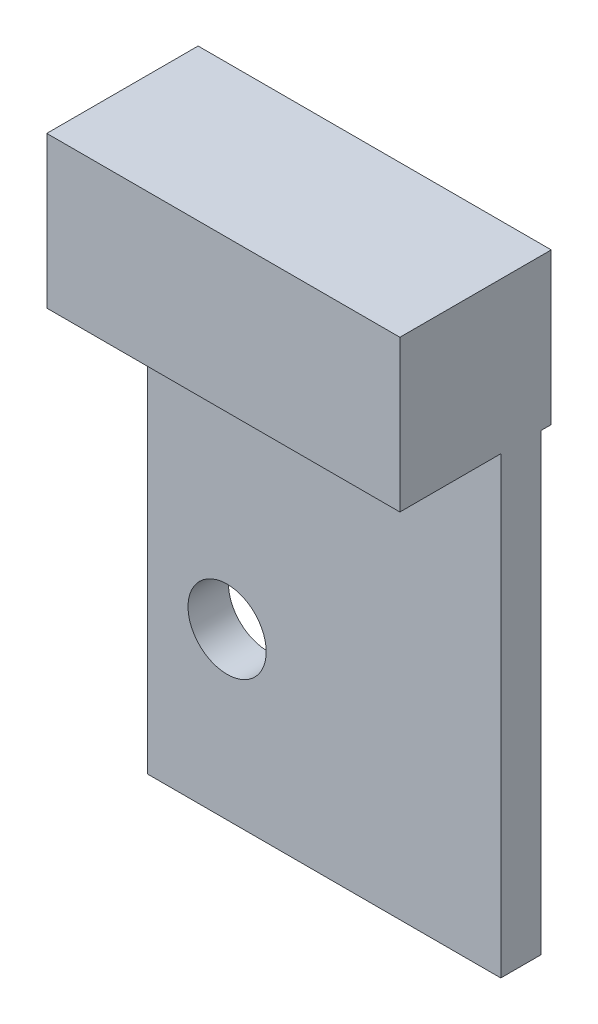
ISO-10303-21;
HEADER;
FILE_DESCRIPTION(('STEP AP214'),'2;1');
FILE_NAME('part.step','',(''),(''),'','','');
FILE_SCHEMA(('AUTOMOTIVE_DESIGN { 1 0 10303 214 1 1 1 1 }'));
ENDSEC;
DATA;
#1=APPLICATION_CONTEXT('core data for automotive mechanical design processes');
#2=APPLICATION_PROTOCOL_DEFINITION('international standard','automotive_design',2000,#1);
#3=PRODUCT_CONTEXT('',#1,'mechanical');
#4=PRODUCT('Part','Part','',(#3));
#5=PRODUCT_RELATED_PRODUCT_CATEGORY('part','',(#4));
#6=PRODUCT_DEFINITION_FORMATION('','',#4);
#7=PRODUCT_DEFINITION_CONTEXT('part definition',#1,'design');
#8=PRODUCT_DEFINITION('design','',#6,#7);
#9=PRODUCT_DEFINITION_SHAPE('','',#8);
#10=(LENGTH_UNIT() NAMED_UNIT(*) SI_UNIT(.MILLI.,.METRE.));
#11=(NAMED_UNIT(*) PLANE_ANGLE_UNIT() SI_UNIT($,.RADIAN.));
#12=(NAMED_UNIT(*) SI_UNIT($,.STERADIAN.) SOLID_ANGLE_UNIT());
#13=UNCERTAINTY_MEASURE_WITH_UNIT(LENGTH_MEASURE(1.E-05),#10,'distance_accuracy_value','');
#14=(GEOMETRIC_REPRESENTATION_CONTEXT(3) GLOBAL_UNCERTAINTY_ASSIGNED_CONTEXT((#13)) GLOBAL_UNIT_ASSIGNED_CONTEXT((#10,
#11,#12)) REPRESENTATION_CONTEXT('',''));
#15=CARTESIAN_POINT('',(0.,0.,0.));
#16=DIRECTION('',(0.,0.,1.));
#17=DIRECTION('',(1.,0.,0.));
#18=AXIS2_PLACEMENT_3D('',#15,#16,#17);
#19=CARTESIAN_POINT('',(7.,9.,1.6));
#20=DIRECTION('',(-1.,0.,0.));
#21=DIRECTION('',(0.,-1.,0.));
#22=AXIS2_PLACEMENT_3D('',#19,#20,#21);
#23=PLANE('',#22);
#24=DIRECTION('',(0.,1.,0.));
#25=VECTOR('',#24,1.);
#26=CARTESIAN_POINT('',(7.,9.,0.));
#27=LINE('',#26,#25);
#28=CARTESIAN_POINT('',(7.,-9.,0.));
#29=VERTEX_POINT('',#28);
#30=CARTESIAN_POINT('',(7.,9.,0.));
#31=VERTEX_POINT('',#30);
#32=EDGE_CURVE('E92',#29,#31,#27,.T.);
#33=ORIENTED_EDGE('',*,*,#32,.T.);
#34=DIRECTION('',(0.,0.,-1.));
#35=VECTOR('',#34,1.);
#36=CARTESIAN_POINT('',(7.,9.,5.6));
#37=LINE('',#36,#35);
#38=CARTESIAN_POINT('',(7.,9.,-0.4));
#39=VERTEX_POINT('',#38);
#40=EDGE_CURVE('E247',#31,#39,#37,.T.);
#41=ORIENTED_EDGE('',*,*,#40,.T.);
#42=DIRECTION('',(0.,1.,0.));
#43=VECTOR('',#42,1.);
#44=CARTESIAN_POINT('',(7.,15.,-0.4));
#45=LINE('',#44,#43);
#46=CARTESIAN_POINT('',(7.,15.,-0.4));
#47=VERTEX_POINT('',#46);
#48=EDGE_CURVE('E237',#39,#47,#45,.T.);
#49=ORIENTED_EDGE('',*,*,#48,.T.);
#50=DIRECTION('',(0.,0.,-1.));
#51=VECTOR('',#50,1.);
#52=CARTESIAN_POINT('',(7.,15.,5.6));
#53=LINE('',#52,#51);
#54=CARTESIAN_POINT('',(7.,15.,5.6));
#55=VERTEX_POINT('',#54);
#56=EDGE_CURVE('E244',#55,#47,#53,.T.);
#57=ORIENTED_EDGE('',*,*,#56,.F.);
#58=DIRECTION('',(0.,1.,0.));
#59=VECTOR('',#58,1.);
#60=CARTESIAN_POINT('',(7.,15.,5.6));
#61=LINE('',#60,#59);
#62=CARTESIAN_POINT('',(7.,9.,5.6));
#63=VERTEX_POINT('',#62);
#64=EDGE_CURVE('E228',#63,#55,#61,.T.);
#65=ORIENTED_EDGE('',*,*,#64,.F.);
#66=CARTESIAN_POINT('',(7.,9.,1.6));
#67=VERTEX_POINT('',#66);
#68=EDGE_CURVE('E248',#63,#67,#37,.T.);
#69=ORIENTED_EDGE('',*,*,#68,.T.);
#70=DIRECTION('',(0.,1.,0.));
#71=VECTOR('',#70,1.);
#72=CARTESIAN_POINT('',(7.,9.,1.6));
#73=LINE('',#72,#71);
#74=CARTESIAN_POINT('',(7.,-9.,1.6));
#75=VERTEX_POINT('',#74);
#76=EDGE_CURVE('E98',#75,#67,#73,.T.);
#77=ORIENTED_EDGE('',*,*,#76,.F.);
#78=DIRECTION('',(0.,0.,-1.));
#79=VECTOR('',#78,1.);
#80=CARTESIAN_POINT('',(7.,-9.,1.6));
#81=LINE('',#80,#79);
#82=EDGE_CURVE('E42',#75,#29,#81,.T.);
#83=ORIENTED_EDGE('',*,*,#82,.T.);
#84=EDGE_LOOP('',(#33,#41,#49,#57,#65,#69,#77,#83));
#85=FACE_BOUND('',#84,.T.);
#86=ADVANCED_FACE('F33',(#85),#23,.F.);
#87=CARTESIAN_POINT('',(-7.,9.,1.6));
#88=DIRECTION('',(1.,0.,0.));
#89=DIRECTION('',(0.,1.,0.));
#90=AXIS2_PLACEMENT_3D('',#87,#88,#89);
#91=PLANE('',#90);
#92=DIRECTION('',(0.,-1.,0.));
#93=VECTOR('',#92,1.);
#94=CARTESIAN_POINT('',(-7.,9.,0.));
#95=LINE('',#94,#93);
#96=CARTESIAN_POINT('',(-7.,9.,0.));
#97=VERTEX_POINT('',#96);
#98=CARTESIAN_POINT('',(-7.,-9.,0.));
#99=VERTEX_POINT('',#98);
#100=EDGE_CURVE('E62',#97,#99,#95,.T.);
#101=ORIENTED_EDGE('',*,*,#100,.T.);
#102=DIRECTION('',(0.,0.,-1.));
#103=VECTOR('',#102,1.);
#104=CARTESIAN_POINT('',(-7.,-9.,1.6));
#105=LINE('',#104,#103);
#106=CARTESIAN_POINT('',(-7.,-9.,1.6));
#107=VERTEX_POINT('',#106);
#108=EDGE_CURVE('E11',#107,#99,#105,.T.);
#109=ORIENTED_EDGE('',*,*,#108,.F.);
#110=DIRECTION('',(0.,-1.,0.));
#111=VECTOR('',#110,1.);
#112=CARTESIAN_POINT('',(-7.,9.,1.6));
#113=LINE('',#112,#111);
#114=CARTESIAN_POINT('',(-7.,9.,1.6));
#115=VERTEX_POINT('',#114);
#116=EDGE_CURVE('E96',#115,#107,#113,.T.);
#117=ORIENTED_EDGE('',*,*,#116,.F.);
#118=DIRECTION('',(0.,0.,-1.));
#119=VECTOR('',#118,1.);
#120=CARTESIAN_POINT('',(-7.,9.,5.6));
#121=LINE('',#120,#119);
#122=CARTESIAN_POINT('',(-7.,9.,5.6));
#123=VERTEX_POINT('',#122);
#124=EDGE_CURVE('E80',#123,#115,#121,.T.);
#125=ORIENTED_EDGE('',*,*,#124,.F.);
#126=DIRECTION('',(0.,-1.,0.));
#127=VECTOR('',#126,1.);
#128=CARTESIAN_POINT('',(-7.,15.,5.6));
#129=LINE('',#128,#127);
#130=CARTESIAN_POINT('',(-7.,15.,5.6));
#131=VERTEX_POINT('',#130);
#132=EDGE_CURVE('E224',#131,#123,#129,.T.);
#133=ORIENTED_EDGE('',*,*,#132,.F.);
#134=DIRECTION('',(0.,0.,-1.));
#135=VECTOR('',#134,1.);
#136=CARTESIAN_POINT('',(-7.,15.,5.6));
#137=LINE('',#136,#135);
#138=CARTESIAN_POINT('',(-7.,15.,-0.4));
#139=VERTEX_POINT('',#138);
#140=EDGE_CURVE('E233',#131,#139,#137,.T.);
#141=ORIENTED_EDGE('',*,*,#140,.T.);
#142=DIRECTION('',(0.,-1.,0.));
#143=VECTOR('',#142,1.);
#144=CARTESIAN_POINT('',(-7.,15.,-0.4));
#145=LINE('',#144,#143);
#146=CARTESIAN_POINT('',(-7.,9.,-0.4));
#147=VERTEX_POINT('',#146);
#148=EDGE_CURVE('E218',#139,#147,#145,.T.);
#149=ORIENTED_EDGE('',*,*,#148,.T.);
#150=EDGE_CURVE('E93',#97,#147,#121,.T.);
#151=ORIENTED_EDGE('',*,*,#150,.F.);
#152=EDGE_LOOP('',(#101,#109,#117,#125,#133,#141,#149,#151));
#153=FACE_BOUND('',#152,.T.);
#154=ADVANCED_FACE('F100',(#153),#91,.F.);
#155=CARTESIAN_POINT('',(-7.,-9.,1.6));
#156=DIRECTION('',(0.,1.,0.));
#157=DIRECTION('',(0.,0.,1.));
#158=AXIS2_PLACEMENT_3D('',#155,#156,#157);
#159=PLANE('',#158);
#160=DIRECTION('',(1.,0.,0.));
#161=VECTOR('',#160,1.);
#162=CARTESIAN_POINT('',(-7.,-9.,0.));
#163=LINE('',#162,#161);
#164=EDGE_CURVE('E109',#99,#29,#163,.T.);
#165=ORIENTED_EDGE('',*,*,#164,.T.);
#166=ORIENTED_EDGE('',*,*,#82,.F.);
#167=DIRECTION('',(1.,0.,0.));
#168=VECTOR('',#167,1.);
#169=CARTESIAN_POINT('',(-7.,-9.,1.6));
#170=LINE('',#169,#168);
#171=EDGE_CURVE('E50',#107,#75,#170,.T.);
#172=ORIENTED_EDGE('',*,*,#171,.F.);
#173=ORIENTED_EDGE('',*,*,#108,.T.);
#174=EDGE_LOOP('',(#165,#166,#172,#173));
#175=FACE_BOUND('',#174,.T.);
#176=ADVANCED_FACE('F119',(#175),#159,.F.);
#177=CARTESIAN_POINT('',(0.,0.,1.6));
#178=DIRECTION('',(0.,0.,1.));
#179=DIRECTION('',(1.,0.,0.));
#180=AXIS2_PLACEMENT_3D('',#177,#178,#179);
#181=PLANE('',#180);
#182=CARTESIAN_POINT('',(-3.85,-2.45,1.6));
#183=DIRECTION('',(0.,0.,1.));
#184=DIRECTION('',(1.,0.,0.));
#185=AXIS2_PLACEMENT_3D('',#182,#183,#184);
#186=CIRCLE('',#185,1.55);
#187=CARTESIAN_POINT('',(-2.3,-2.45,1.6));
#188=VERTEX_POINT('',#187);
#189=EDGE_CURVE('E215',#188,#188,#186,.T.);
#190=ORIENTED_EDGE('',*,*,#189,.F.);
#191=EDGE_LOOP('',(#190));
#192=FACE_BOUND('',#191,.T.);
#193=ORIENTED_EDGE('',*,*,#76,.T.);
#194=DIRECTION('',(-1.,0.,0.));
#195=VECTOR('',#194,1.);
#196=CARTESIAN_POINT('',(-7.,9.,1.6));
#197=LINE('',#196,#195);
#198=EDGE_CURVE('E84',#67,#115,#197,.T.);
#199=ORIENTED_EDGE('',*,*,#198,.T.);
#200=ORIENTED_EDGE('',*,*,#116,.T.);
#201=ORIENTED_EDGE('',*,*,#171,.T.);
#202=EDGE_LOOP('',(#193,#199,#200,#201));
#203=FACE_BOUND('',#202,.T.);
#204=ADVANCED_FACE('F95',(#192,#203),#181,.T.);
#205=CARTESIAN_POINT('',(0.,0.,0.));
#206=DIRECTION('',(0.,0.,1.));
#207=DIRECTION('',(1.,0.,0.));
#208=AXIS2_PLACEMENT_3D('',#205,#206,#207);
#209=PLANE('',#208);
#210=CARTESIAN_POINT('',(-3.85,-2.45,0.));
#211=DIRECTION('',(0.,0.,1.));
#212=DIRECTION('',(1.,0.,0.));
#213=AXIS2_PLACEMENT_3D('',#210,#211,#212);
#214=CIRCLE('',#213,1.55);
#215=CARTESIAN_POINT('',(-2.3,-2.45,0.));
#216=VERTEX_POINT('',#215);
#217=EDGE_CURVE('E36',#216,#216,#214,.T.);
#218=ORIENTED_EDGE('',*,*,#217,.T.);
#219=EDGE_LOOP('',(#218));
#220=FACE_BOUND('',#219,.T.);
#221=ORIENTED_EDGE('',*,*,#32,.F.);
#222=ORIENTED_EDGE('',*,*,#164,.F.);
#223=ORIENTED_EDGE('',*,*,#100,.F.);
#224=DIRECTION('',(-1.,0.,0.));
#225=VECTOR('',#224,1.);
#226=CARTESIAN_POINT('',(-7.,9.,0.));
#227=LINE('',#226,#225);
#228=EDGE_CURVE('E71',#31,#97,#227,.T.);
#229=ORIENTED_EDGE('',*,*,#228,.F.);
#230=EDGE_LOOP('',(#221,#222,#223,#229));
#231=FACE_BOUND('',#230,.T.);
#232=ADVANCED_FACE('F118',(#220,#231),#209,.F.);
#233=CARTESIAN_POINT('',(-7.,9.,5.6));
#234=DIRECTION('',(0.,1.,0.));
#235=DIRECTION('',(-1.,0.,0.));
#236=AXIS2_PLACEMENT_3D('',#233,#234,#235);
#237=PLANE('',#236);
#238=ORIENTED_EDGE('',*,*,#40,.F.);
#239=ORIENTED_EDGE('',*,*,#228,.T.);
#240=ORIENTED_EDGE('',*,*,#150,.T.);
#241=DIRECTION('',(1.,0.,0.));
#242=VECTOR('',#241,1.);
#243=CARTESIAN_POINT('',(-7.,9.,-0.4));
#244=LINE('',#243,#242);
#245=EDGE_CURVE('E220',#147,#39,#244,.T.);
#246=ORIENTED_EDGE('',*,*,#245,.T.);
#247=EDGE_LOOP('',(#238,#239,#240,#246));
#248=FACE_BOUND('',#247,.T.);
#249=ADVANCED_FACE('F143',(#248),#237,.F.);
#250=ORIENTED_EDGE('',*,*,#198,.F.);
#251=ORIENTED_EDGE('',*,*,#68,.F.);
#252=DIRECTION('',(1.,0.,0.));
#253=VECTOR('',#252,1.);
#254=CARTESIAN_POINT('',(-7.,9.,5.6));
#255=LINE('',#254,#253);
#256=EDGE_CURVE('E88',#123,#63,#255,.T.);
#257=ORIENTED_EDGE('',*,*,#256,.F.);
#258=ORIENTED_EDGE('',*,*,#124,.T.);
#259=EDGE_LOOP('',(#250,#251,#257,#258));
#260=FACE_BOUND('',#259,.T.);
#261=ADVANCED_FACE('F82',(#260),#237,.F.);
#262=CARTESIAN_POINT('',(-7.,15.,5.6));
#263=DIRECTION('',(0.,-1.,0.));
#264=DIRECTION('',(1.,0.,0.));
#265=AXIS2_PLACEMENT_3D('',#262,#263,#264);
#266=PLANE('',#265);
#267=DIRECTION('',(-1.,0.,0.));
#268=VECTOR('',#267,1.);
#269=CARTESIAN_POINT('',(-7.,15.,-0.4));
#270=LINE('',#269,#268);
#271=EDGE_CURVE('E226',#47,#139,#270,.T.);
#272=ORIENTED_EDGE('',*,*,#271,.T.);
#273=ORIENTED_EDGE('',*,*,#140,.F.);
#274=DIRECTION('',(-1.,0.,0.));
#275=VECTOR('',#274,1.);
#276=CARTESIAN_POINT('',(-7.,15.,5.6));
#277=LINE('',#276,#275);
#278=EDGE_CURVE('E231',#55,#131,#277,.T.);
#279=ORIENTED_EDGE('',*,*,#278,.F.);
#280=ORIENTED_EDGE('',*,*,#56,.T.);
#281=EDGE_LOOP('',(#272,#273,#279,#280));
#282=FACE_BOUND('',#281,.T.);
#283=ADVANCED_FACE('F156',(#282),#266,.F.);
#284=CARTESIAN_POINT('',(0.,0.,5.6));
#285=DIRECTION('',(0.,0.,1.));
#286=DIRECTION('',(1.,0.,0.));
#287=AXIS2_PLACEMENT_3D('',#284,#285,#286);
#288=PLANE('',#287);
#289=ORIENTED_EDGE('',*,*,#132,.T.);
#290=ORIENTED_EDGE('',*,*,#256,.T.);
#291=ORIENTED_EDGE('',*,*,#64,.T.);
#292=ORIENTED_EDGE('',*,*,#278,.T.);
#293=EDGE_LOOP('',(#289,#290,#291,#292));
#294=FACE_BOUND('',#293,.T.);
#295=ADVANCED_FACE('F164',(#294),#288,.T.);
#296=CARTESIAN_POINT('',(0.,0.,-0.4));
#297=DIRECTION('',(0.,0.,1.));
#298=DIRECTION('',(1.,0.,0.));
#299=AXIS2_PLACEMENT_3D('',#296,#297,#298);
#300=PLANE('',#299);
#301=ORIENTED_EDGE('',*,*,#148,.F.);
#302=ORIENTED_EDGE('',*,*,#271,.F.);
#303=ORIENTED_EDGE('',*,*,#48,.F.);
#304=ORIENTED_EDGE('',*,*,#245,.F.);
#305=EDGE_LOOP('',(#301,#302,#303,#304));
#306=FACE_BOUND('',#305,.T.);
#307=ADVANCED_FACE('F174',(#306),#300,.F.);
#308=CARTESIAN_POINT('',(-3.85,-2.45,-0.4));
#309=DIRECTION('',(0.,0.,1.));
#310=DIRECTION('',(1.,0.,0.));
#311=AXIS2_PLACEMENT_3D('',#308,#309,#310);
#312=CYLINDRICAL_SURFACE('',#311,1.55);
#313=ORIENTED_EDGE('',*,*,#189,.T.);
#314=EDGE_LOOP('',(#313));
#315=FACE_BOUND('',#314,.T.);
#316=ORIENTED_EDGE('',*,*,#217,.F.);
#317=EDGE_LOOP('',(#316));
#318=FACE_BOUND('',#317,.T.);
#319=ADVANCED_FACE('F184',(#315,#318),#312,.F.);
#320=CLOSED_SHELL('',(#86,#154,#176,#204,#232,#249,#261,#283,#295,#307,#319));
#321=MANIFOLD_SOLID_BREP('B2',#320);
#322=ADVANCED_BREP_SHAPE_REPRESENTATION('',(#18,#321),#14);
#323=SHAPE_DEFINITION_REPRESENTATION(#9,#322);
ENDSEC;
END-ISO-10303-21;
